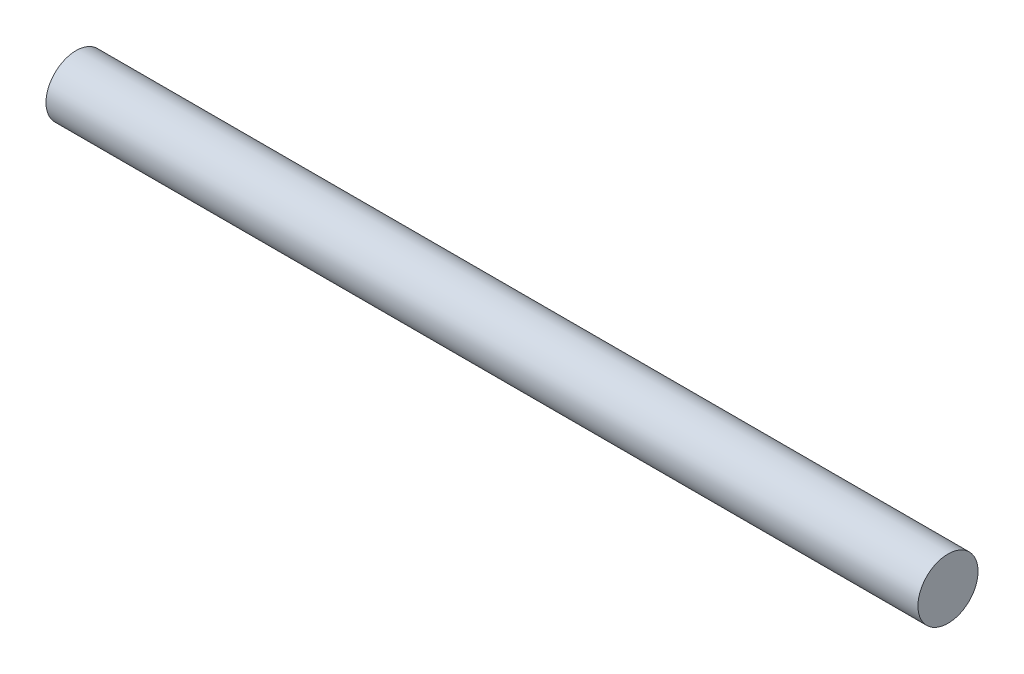
ISO-10303-21;
HEADER;
FILE_DESCRIPTION(('STEP AP214'),'2;1');
FILE_NAME('part.step','',(''),(''),'','','');
FILE_SCHEMA(('AUTOMOTIVE_DESIGN { 1 0 10303 214 1 1 1 1 }'));
ENDSEC;
DATA;
#1=APPLICATION_CONTEXT('core data for automotive mechanical design processes');
#2=APPLICATION_PROTOCOL_DEFINITION('international standard','automotive_design',2000,#1);
#3=PRODUCT_CONTEXT('',#1,'mechanical');
#4=PRODUCT('Part','Part','',(#3));
#5=PRODUCT_RELATED_PRODUCT_CATEGORY('part','',(#4));
#6=PRODUCT_DEFINITION_FORMATION('','',#4);
#7=PRODUCT_DEFINITION_CONTEXT('part definition',#1,'design');
#8=PRODUCT_DEFINITION('design','',#6,#7);
#9=PRODUCT_DEFINITION_SHAPE('','',#8);
#10=(LENGTH_UNIT() NAMED_UNIT(*) SI_UNIT(.MILLI.,.METRE.));
#11=(NAMED_UNIT(*) PLANE_ANGLE_UNIT() SI_UNIT($,.RADIAN.));
#12=(NAMED_UNIT(*) SI_UNIT($,.STERADIAN.) SOLID_ANGLE_UNIT());
#13=UNCERTAINTY_MEASURE_WITH_UNIT(LENGTH_MEASURE(1.E-05),#10,'distance_accuracy_value','');
#14=(GEOMETRIC_REPRESENTATION_CONTEXT(3) GLOBAL_UNCERTAINTY_ASSIGNED_CONTEXT((#13)) GLOBAL_UNIT_ASSIGNED_CONTEXT((#10,
#11,#12)) REPRESENTATION_CONTEXT('',''));
#15=CARTESIAN_POINT('',(0.,0.,0.));
#16=DIRECTION('',(0.,0.,1.));
#17=DIRECTION('',(1.,0.,0.));
#18=AXIS2_PLACEMENT_3D('',#15,#16,#17);
#19=CARTESIAN_POINT('',(14.5,0.,0.));
#20=DIRECTION('',(-1.,0.,0.));
#21=DIRECTION('',(0.,0.,1.));
#22=AXIS2_PLACEMENT_3D('',#19,#20,#21);
#23=CYLINDRICAL_SURFACE('',#22,1.);
#24=CARTESIAN_POINT('',(14.5,0.,0.));
#25=DIRECTION('',(1.,0.,0.));
#26=DIRECTION('',(0.,0.,-1.));
#27=AXIS2_PLACEMENT_3D('',#24,#25,#26);
#28=CIRCLE('',#27,1.);
#29=CARTESIAN_POINT('',(14.5,0.,1.));
#30=VERTEX_POINT('',#29);
#31=EDGE_CURVE('E10',#30,#30,#28,.T.);
#32=CARTESIAN_POINT('',(-14.5,0.,0.));
#33=DIRECTION('',(1.,0.,0.));
#34=DIRECTION('',(0.,0.,-1.));
#35=AXIS2_PLACEMENT_3D('',#32,#33,#34);
#36=CIRCLE('',#35,1.);
#37=CARTESIAN_POINT('',(-14.5,0.,1.));
#38=VERTEX_POINT('',#37);
#39=EDGE_CURVE('E38',#38,#38,#36,.T.);
#40=CARTESIAN_POINT('',(14.5,0.,1.));
#41=CARTESIAN_POINT('',(14.1979166666667,0.,1.));
#42=CARTESIAN_POINT('',(13.8958333333333,0.,1.));
#43=CARTESIAN_POINT('',(13.2916666666667,0.,1.));
#44=CARTESIAN_POINT('',(12.9895833333333,0.,1.));
#45=CARTESIAN_POINT('',(12.3854166666667,0.,1.));
#46=CARTESIAN_POINT('',(12.0833333333333,0.,1.));
#47=CARTESIAN_POINT('',(11.4791666666667,0.,1.));
#48=CARTESIAN_POINT('',(11.1770833333333,0.,1.));
#49=CARTESIAN_POINT('',(10.5729166666667,0.,1.));
#50=CARTESIAN_POINT('',(10.2708333333333,0.,1.));
#51=CARTESIAN_POINT('',(9.66666666666667,0.,1.));
#52=CARTESIAN_POINT('',(9.36458333333333,0.,1.));
#53=CARTESIAN_POINT('',(8.76041666666667,0.,1.));
#54=CARTESIAN_POINT('',(8.45833333333333,0.,1.));
#55=CARTESIAN_POINT('',(7.85416666666667,0.,1.));
#56=CARTESIAN_POINT('',(7.55208333333333,0.,1.));
#57=CARTESIAN_POINT('',(6.94791666666667,0.,1.));
#58=CARTESIAN_POINT('',(6.64583333333333,0.,1.));
#59=CARTESIAN_POINT('',(6.04166666666667,0.,1.));
#60=CARTESIAN_POINT('',(5.73958333333333,0.,1.));
#61=CARTESIAN_POINT('',(5.13541666666667,0.,1.));
#62=CARTESIAN_POINT('',(4.83333333333333,0.,1.));
#63=CARTESIAN_POINT('',(4.22916666666667,0.,1.));
#64=CARTESIAN_POINT('',(3.92708333333333,0.,1.));
#65=CARTESIAN_POINT('',(3.32291666666667,0.,1.));
#66=CARTESIAN_POINT('',(3.02083333333333,0.,1.));
#67=CARTESIAN_POINT('',(2.41666666666667,0.,1.));
#68=CARTESIAN_POINT('',(2.11458333333333,0.,1.));
#69=CARTESIAN_POINT('',(1.51041666666667,0.,1.));
#70=CARTESIAN_POINT('',(1.20833333333333,0.,1.));
#71=CARTESIAN_POINT('',(0.604166666666667,0.,1.));
#72=CARTESIAN_POINT('',(0.302083333333334,0.,1.));
#73=CARTESIAN_POINT('',(-0.302083333333334,0.,1.));
#74=CARTESIAN_POINT('',(-0.604166666666667,0.,1.));
#75=CARTESIAN_POINT('',(-1.20833333333333,0.,1.));
#76=CARTESIAN_POINT('',(-1.51041666666667,0.,1.));
#77=CARTESIAN_POINT('',(-2.11458333333333,0.,1.));
#78=CARTESIAN_POINT('',(-2.41666666666667,0.,1.));
#79=CARTESIAN_POINT('',(-3.02083333333333,0.,1.));
#80=CARTESIAN_POINT('',(-3.32291666666666,0.,1.));
#81=CARTESIAN_POINT('',(-3.92708333333333,0.,1.));
#82=CARTESIAN_POINT('',(-4.22916666666667,0.,1.));
#83=CARTESIAN_POINT('',(-4.83333333333333,0.,1.));
#84=CARTESIAN_POINT('',(-5.13541666666667,0.,1.));
#85=CARTESIAN_POINT('',(-5.73958333333333,0.,1.));
#86=CARTESIAN_POINT('',(-6.04166666666667,0.,1.));
#87=CARTESIAN_POINT('',(-6.64583333333333,0.,1.));
#88=CARTESIAN_POINT('',(-6.94791666666667,0.,1.));
#89=CARTESIAN_POINT('',(-7.55208333333333,0.,1.));
#90=CARTESIAN_POINT('',(-7.85416666666667,0.,1.));
#91=CARTESIAN_POINT('',(-8.45833333333333,0.,1.));
#92=CARTESIAN_POINT('',(-8.76041666666667,0.,1.));
#93=CARTESIAN_POINT('',(-9.36458333333333,0.,1.));
#94=CARTESIAN_POINT('',(-9.66666666666667,0.,1.));
#95=CARTESIAN_POINT('',(-10.2708333333333,0.,1.));
#96=CARTESIAN_POINT('',(-10.5729166666667,0.,1.));
#97=CARTESIAN_POINT('',(-11.1770833333333,0.,1.));
#98=CARTESIAN_POINT('',(-11.4791666666667,0.,1.));
#99=CARTESIAN_POINT('',(-12.0833333333333,0.,1.));
#100=CARTESIAN_POINT('',(-12.3854166666667,0.,1.));
#101=CARTESIAN_POINT('',(-12.9895833333333,0.,1.));
#102=CARTESIAN_POINT('',(-13.2916666666667,0.,1.));
#103=CARTESIAN_POINT('',(-13.8958333333333,0.,1.));
#104=CARTESIAN_POINT('',(-14.1979166666667,0.,1.));
#105=CARTESIAN_POINT('',(-14.5,0.,1.));
#106=B_SPLINE_CURVE_WITH_KNOTS('',3,(#40,#41,#42,#43,#44,#45,#46,#47,#48,#49,#50,#51,#52,#53,
#54,#55,#56,#57,#58,#59,#60,#61,#62,#63,#64,#65,#66,#67,#68,#69,#70,#71,#72,#73,#74,#75,#76,#77,
#78,#79,#80,#81,#82,#83,#84,#85,#86,#87,#88,#89,#90,#91,#92,#93,#94,#95,#96,#97,#98,#99,#100,
#101,#102,#103,#104,#105),.UNSPECIFIED.,.F.,.F.,(4,2,2,2,2,2,2,2,2,2,2,2,2,2,2,2,2,2,2,2,2,2,2,
2,2,2,2,2,2,2,2,2,4),(0.,0.906250000000001,1.8125,2.71875,3.625,4.53125,5.4375,6.34375,7.25,
8.15625,9.0625,9.96875,10.875,11.78125,12.6875,13.59375,14.5,15.40625,16.3125,17.21875,18.125,
19.03125,19.9375,20.84375,21.75,22.65625,23.5625,24.46875,25.375,26.28125,27.1875,28.09375,29.),.UNSPECIFIED.);
#107=EDGE_CURVE('BSEAM35',#30,#38,#106,.T.);
#108=ORIENTED_EDGE('',*,*,#31,.F.);
#109=ORIENTED_EDGE('',*,*,#39,.T.);
#110=ORIENTED_EDGE('',*,*,#107,.T.);
#111=ORIENTED_EDGE('',*,*,#107,.F.);
#112=EDGE_LOOP('',(#108,#110,#109,#111));
#113=FACE_BOUND('',#112,.T.);
#114=ADVANCED_FACE('F35',(#113),#23,.T.);
#115=CARTESIAN_POINT('',(14.5,0.,0.));
#116=DIRECTION('',(1.,0.,0.));
#117=DIRECTION('',(0.,0.,-1.));
#118=AXIS2_PLACEMENT_3D('',#115,#116,#117);
#119=PLANE('',#118);
#120=ORIENTED_EDGE('',*,*,#31,.T.);
#121=EDGE_LOOP('',(#120));
#122=FACE_BOUND('',#121,.T.);
#123=ADVANCED_FACE('F50',(#122),#119,.T.);
#124=CARTESIAN_POINT('',(-14.5,0.,0.));
#125=DIRECTION('',(1.,0.,0.));
#126=DIRECTION('',(0.,0.,-1.));
#127=AXIS2_PLACEMENT_3D('',#124,#125,#126);
#128=PLANE('',#127);
#129=ORIENTED_EDGE('',*,*,#39,.F.);
#130=EDGE_LOOP('',(#129));
#131=FACE_BOUND('',#130,.T.);
#132=ADVANCED_FACE('F48',(#131),#128,.F.);
#133=CLOSED_SHELL('',(#114,#123,#132));
#134=MANIFOLD_SOLID_BREP('B2',#133);
#135=ADVANCED_BREP_SHAPE_REPRESENTATION('',(#18,#134),#14);
#136=SHAPE_DEFINITION_REPRESENTATION(#9,#135);
ENDSEC;
END-ISO-10303-21;
